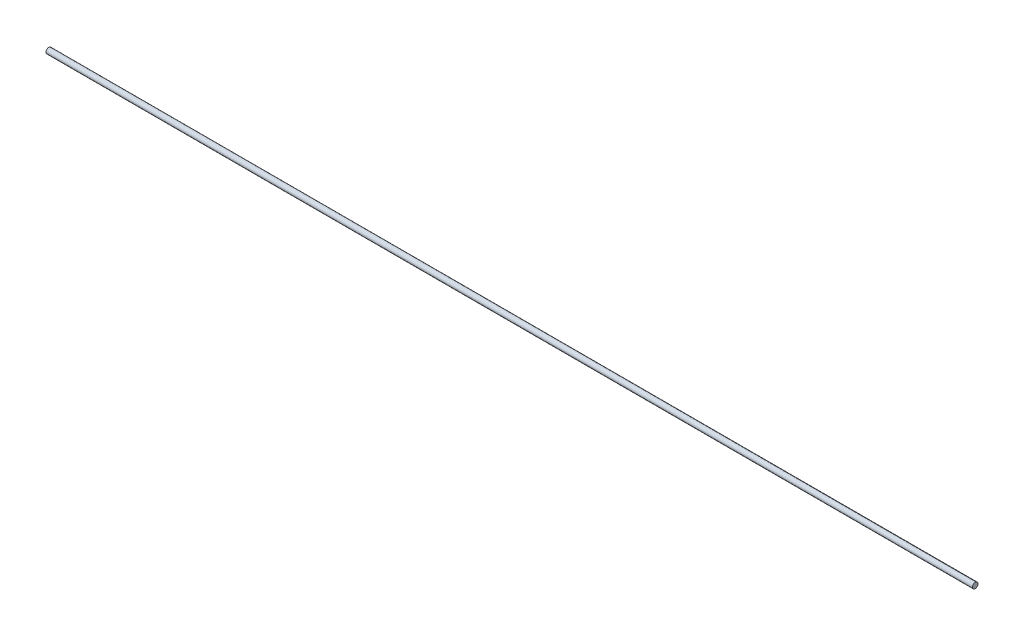
ISO-10303-21;
HEADER;
FILE_DESCRIPTION(('STEP AP214'),'2;1');
FILE_NAME('part.step','',(''),(''),'','','');
FILE_SCHEMA(('AUTOMOTIVE_DESIGN { 1 0 10303 214 1 1 1 1 }'));
ENDSEC;
DATA;
#1=APPLICATION_CONTEXT('core data for automotive mechanical design processes');
#2=APPLICATION_PROTOCOL_DEFINITION('international standard','automotive_design',2000,#1);
#3=PRODUCT_CONTEXT('',#1,'mechanical');
#4=PRODUCT('Part','Part','',(#3));
#5=PRODUCT_RELATED_PRODUCT_CATEGORY('part','',(#4));
#6=PRODUCT_DEFINITION_FORMATION('','',#4);
#7=PRODUCT_DEFINITION_CONTEXT('part definition',#1,'design');
#8=PRODUCT_DEFINITION('design','',#6,#7);
#9=PRODUCT_DEFINITION_SHAPE('','',#8);
#10=(LENGTH_UNIT() NAMED_UNIT(*) SI_UNIT(.MILLI.,.METRE.));
#11=(NAMED_UNIT(*) PLANE_ANGLE_UNIT() SI_UNIT($,.RADIAN.));
#12=(NAMED_UNIT(*) SI_UNIT($,.STERADIAN.) SOLID_ANGLE_UNIT());
#13=UNCERTAINTY_MEASURE_WITH_UNIT(LENGTH_MEASURE(1.E-05),#10,'distance_accuracy_value','');
#14=(GEOMETRIC_REPRESENTATION_CONTEXT(3) GLOBAL_UNCERTAINTY_ASSIGNED_CONTEXT((#13)) GLOBAL_UNIT_ASSIGNED_CONTEXT((#10,
#11,#12)) REPRESENTATION_CONTEXT('',''));
#15=CARTESIAN_POINT('',(0.,0.,0.));
#16=DIRECTION('',(0.,0.,1.));
#17=DIRECTION('',(1.,0.,0.));
#18=AXIS2_PLACEMENT_3D('',#15,#16,#17);
#19=CARTESIAN_POINT('',(2000.,0.,0.));
#20=DIRECTION('',(-1.,0.,0.));
#21=DIRECTION('',(0.,0.,1.));
#22=AXIS2_PLACEMENT_3D('',#19,#20,#21);
#23=CYLINDRICAL_SURFACE('',#22,6.);
#24=CARTESIAN_POINT('',(2000.,0.,0.));
#25=DIRECTION('',(1.,0.,0.));
#26=DIRECTION('',(0.,0.,-1.));
#27=AXIS2_PLACEMENT_3D('',#24,#25,#26);
#28=CIRCLE('',#27,6.);
#29=CARTESIAN_POINT('',(2000.,0.,-6.));
#30=VERTEX_POINT('',#29);
#31=EDGE_CURVE('E10',#30,#30,#28,.T.);
#32=ORIENTED_EDGE('',*,*,#31,.F.);
#33=EDGE_LOOP('',(#32));
#34=FACE_BOUND('',#33,.T.);
#35=CARTESIAN_POINT('',(0.,0.,0.));
#36=DIRECTION('',(1.,0.,0.));
#37=DIRECTION('',(0.,0.,-1.));
#38=AXIS2_PLACEMENT_3D('',#35,#36,#37);
#39=CIRCLE('',#38,6.);
#40=CARTESIAN_POINT('',(0.,0.,-6.));
#41=VERTEX_POINT('',#40);
#42=EDGE_CURVE('E35',#41,#41,#39,.T.);
#43=ORIENTED_EDGE('',*,*,#42,.T.);
#44=EDGE_LOOP('',(#43));
#45=FACE_BOUND('',#44,.T.);
#46=ADVANCED_FACE('F32',(#34,#45),#23,.T.);
#47=CARTESIAN_POINT('',(2000.,0.,0.));
#48=DIRECTION('',(1.,0.,0.));
#49=DIRECTION('',(0.,0.,-1.));
#50=AXIS2_PLACEMENT_3D('',#47,#48,#49);
#51=PLANE('',#50);
#52=ORIENTED_EDGE('',*,*,#31,.T.);
#53=EDGE_LOOP('',(#52));
#54=FACE_BOUND('',#53,.T.);
#55=ADVANCED_FACE('F47',(#54),#51,.T.);
#56=CARTESIAN_POINT('',(0.,0.,0.));
#57=DIRECTION('',(1.,0.,0.));
#58=DIRECTION('',(0.,0.,-1.));
#59=AXIS2_PLACEMENT_3D('',#56,#57,#58);
#60=PLANE('',#59);
#61=ORIENTED_EDGE('',*,*,#42,.F.);
#62=EDGE_LOOP('',(#61));
#63=FACE_BOUND('',#62,.T.);
#64=ADVANCED_FACE('F45',(#63),#60,.F.);
#65=CLOSED_SHELL('',(#46,#55,#64));
#66=MANIFOLD_SOLID_BREP('B2',#65);
#67=ADVANCED_BREP_SHAPE_REPRESENTATION('',(#18,#66),#14);
#68=SHAPE_DEFINITION_REPRESENTATION(#9,#67);
ENDSEC;
END-ISO-10303-21;
